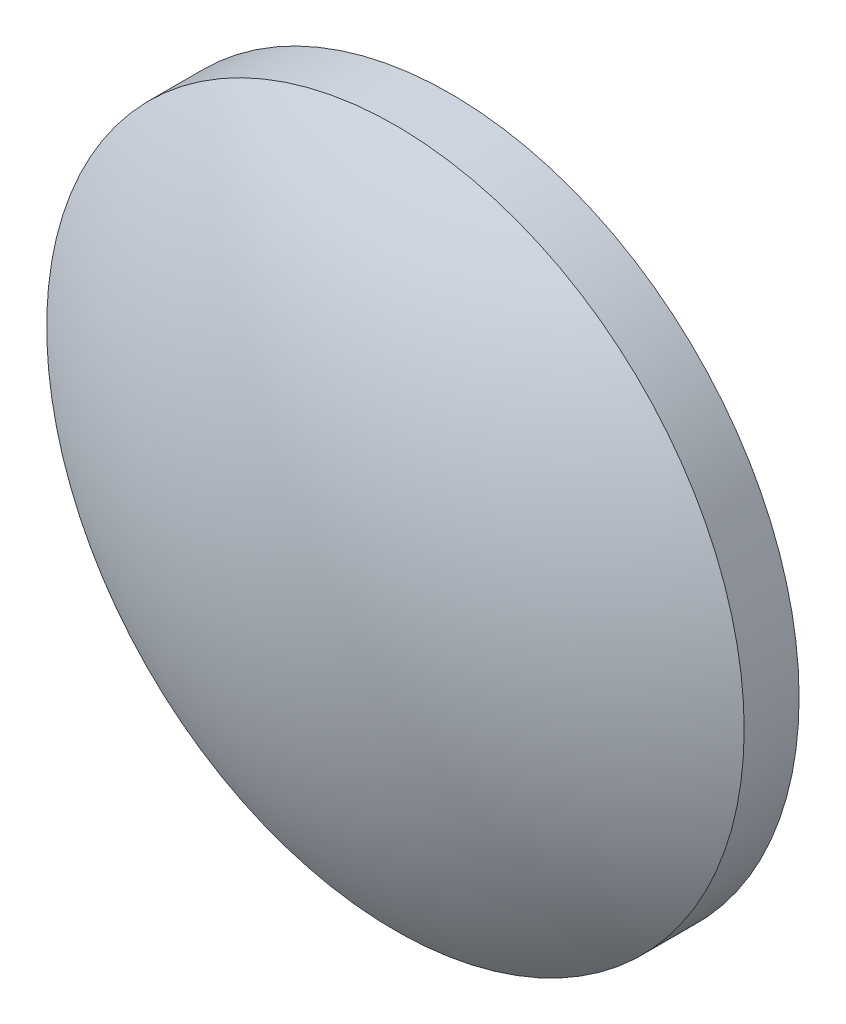
ISO-10303-21;
HEADER;
FILE_DESCRIPTION(('STEP AP214'),'2;1');
FILE_NAME('part.step','',(''),(''),'','','');
FILE_SCHEMA(('AUTOMOTIVE_DESIGN { 1 0 10303 214 1 1 1 1 }'));
ENDSEC;
DATA;
#1=APPLICATION_CONTEXT('core data for automotive mechanical design processes');
#2=APPLICATION_PROTOCOL_DEFINITION('international standard','automotive_design',2000,#1);
#3=PRODUCT_CONTEXT('',#1,'mechanical');
#4=PRODUCT('Part','Part','',(#3));
#5=PRODUCT_RELATED_PRODUCT_CATEGORY('part','',(#4));
#6=PRODUCT_DEFINITION_FORMATION('','',#4);
#7=PRODUCT_DEFINITION_CONTEXT('part definition',#1,'design');
#8=PRODUCT_DEFINITION('design','',#6,#7);
#9=PRODUCT_DEFINITION_SHAPE('','',#8);
#10=(LENGTH_UNIT() NAMED_UNIT(*) SI_UNIT(.MILLI.,.METRE.));
#11=(NAMED_UNIT(*) PLANE_ANGLE_UNIT() SI_UNIT($,.RADIAN.));
#12=(NAMED_UNIT(*) SI_UNIT($,.STERADIAN.) SOLID_ANGLE_UNIT());
#13=UNCERTAINTY_MEASURE_WITH_UNIT(LENGTH_MEASURE(1.E-05),#10,'distance_accuracy_value','');
#14=(GEOMETRIC_REPRESENTATION_CONTEXT(3) GLOBAL_UNCERTAINTY_ASSIGNED_CONTEXT((#13)) GLOBAL_UNIT_ASSIGNED_CONTEXT((#10,
#11,#12)) REPRESENTATION_CONTEXT('',''));
#15=CARTESIAN_POINT('',(0.,0.,0.));
#16=DIRECTION('',(0.,0.,1.));
#17=DIRECTION('',(1.,0.,0.));
#18=AXIS2_PLACEMENT_3D('',#15,#16,#17);
#19=CARTESIAN_POINT('',(0.00639396811435555,0.,-20.0899991112428));
#20=DIRECTION('',(0.,-1.,0.));
#21=DIRECTION('',(1.,0.,0.));
#22=AXIS2_PLACEMENT_3D('',#19,#20,#21);
#23=CIRCLE('',#22,23.);
#24=TRIMMED_CURVE('',#23,(PARAMETER_VALUE(-1.57107432541215)),
(PARAMETER_VALUE(1.57107432541215)),.T.,.PARAMETER.);
#25=CARTESIAN_POINT('',(0.,0.,-20.0899991112428));
#26=DIRECTION('',(0.,0.,1.));
#27=AXIS1_PLACEMENT('',#25,#26);
#28=SURFACE_OF_REVOLUTION('',#24,#27);
#29=CARTESIAN_POINT('',(0.,0.,2.91));
#30=VERTEX_POINT('',#29);
#31=VERTEX_LOOP('',#30);
#32=FACE_BOUND('',#31,.T.);
#33=CARTESIAN_POINT('',(0.,0.,-0.910000000000001));
#34=DIRECTION('',(0.,0.,1.));
#35=DIRECTION('',(1.,0.,0.));
#36=AXIS2_PLACEMENT_3D('',#33,#34,#35);
#37=CIRCLE('',#36,12.7);
#38=CARTESIAN_POINT('',(12.7,0.,-0.910000000000001));
#39=VERTEX_POINT('',#38);
#40=EDGE_CURVE('E21',#39,#39,#37,.T.);
#41=ORIENTED_EDGE('',*,*,#40,.T.);
#42=EDGE_LOOP('',(#41));
#43=FACE_BOUND('',#42,.T.);
#44=ADVANCED_FACE('F15',(#32,#43),#28,.T.);
#45=CARTESIAN_POINT('',(0.,0.,-2.91));
#46=DIRECTION('',(0.,0.,1.));
#47=DIRECTION('',(1.,0.,0.));
#48=AXIS2_PLACEMENT_3D('',#45,#46,#47);
#49=PLANE('',#48);
#50=CARTESIAN_POINT('',(0.,0.,-2.91));
#51=DIRECTION('',(0.,0.,1.));
#52=DIRECTION('',(1.,0.,0.));
#53=AXIS2_PLACEMENT_3D('',#50,#51,#52);
#54=CIRCLE('',#53,12.7);
#55=CARTESIAN_POINT('',(12.7,0.,-2.91));
#56=VERTEX_POINT('',#55);
#57=EDGE_CURVE('E10',#56,#56,#54,.T.);
#58=ORIENTED_EDGE('',*,*,#57,.F.);
#59=EDGE_LOOP('',(#58));
#60=FACE_BOUND('',#59,.T.);
#61=ADVANCED_FACE('F26',(#60),#49,.F.);
#62=CARTESIAN_POINT('',(0.,0.,35.9400018251086));
#63=DIRECTION('',(0.,0.,1.));
#64=DIRECTION('',(1.,0.,0.));
#65=AXIS2_PLACEMENT_3D('',#62,#63,#64);
#66=CYLINDRICAL_SURFACE('',#65,12.7);
#67=ORIENTED_EDGE('',*,*,#40,.F.);
#68=EDGE_LOOP('',(#67));
#69=FACE_BOUND('',#68,.T.);
#70=ORIENTED_EDGE('',*,*,#57,.T.);
#71=EDGE_LOOP('',(#70));
#72=FACE_BOUND('',#71,.T.);
#73=ADVANCED_FACE('F30',(#69,#72),#66,.T.);
#74=CLOSED_SHELL('',(#44,#61,#73));
#75=MANIFOLD_SOLID_BREP('B1',#74);
#76=ADVANCED_BREP_SHAPE_REPRESENTATION('',(#18,#75),#14);
#77=SHAPE_DEFINITION_REPRESENTATION(#9,#76);
ENDSEC;
END-ISO-10303-21;
